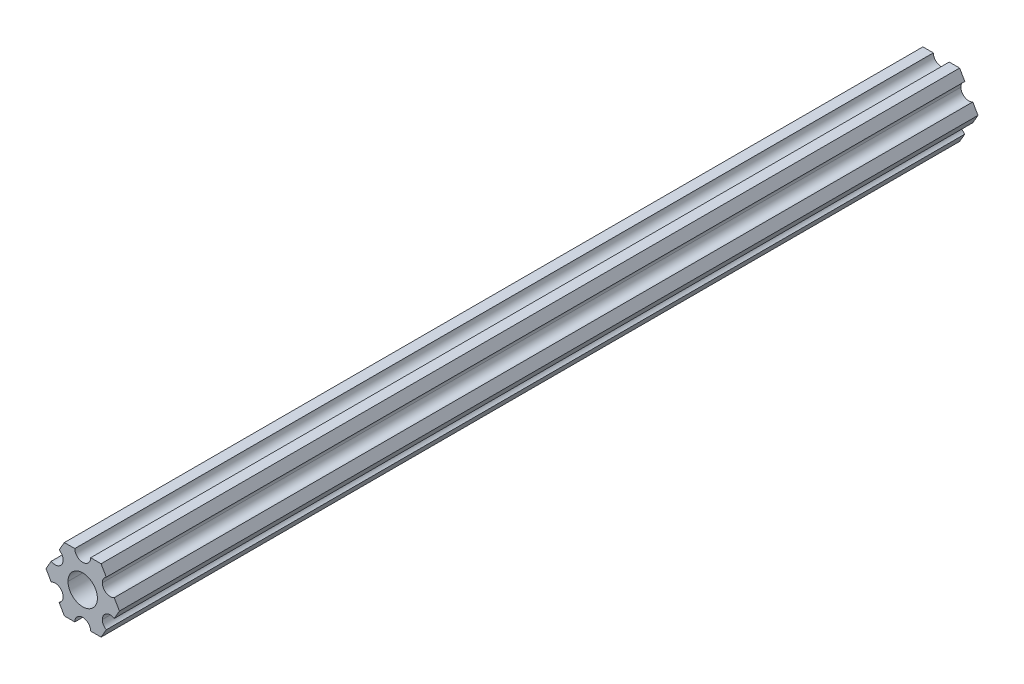
ISO-10303-21;
HEADER;
FILE_DESCRIPTION(('STEP AP214'),'2;1');
FILE_NAME('part.step','',(''),(''),'','','');
FILE_SCHEMA(('AUTOMOTIVE_DESIGN { 1 0 10303 214 1 1 1 1 }'));
ENDSEC;
DATA;
#1=APPLICATION_CONTEXT('core data for automotive mechanical design processes');
#2=APPLICATION_PROTOCOL_DEFINITION('international standard','automotive_design',2000,#1);
#3=PRODUCT_CONTEXT('',#1,'mechanical');
#4=PRODUCT('Part','Part','',(#3));
#5=PRODUCT_RELATED_PRODUCT_CATEGORY('part','',(#4));
#6=PRODUCT_DEFINITION_FORMATION('','',#4);
#7=PRODUCT_DEFINITION_CONTEXT('part definition',#1,'design');
#8=PRODUCT_DEFINITION('design','',#6,#7);
#9=PRODUCT_DEFINITION_SHAPE('','',#8);
#10=(LENGTH_UNIT() NAMED_UNIT(*) SI_UNIT(.MILLI.,.METRE.));
#11=(NAMED_UNIT(*) PLANE_ANGLE_UNIT() SI_UNIT($,.RADIAN.));
#12=(NAMED_UNIT(*) SI_UNIT($,.STERADIAN.) SOLID_ANGLE_UNIT());
#13=UNCERTAINTY_MEASURE_WITH_UNIT(LENGTH_MEASURE(1.E-05),#10,'distance_accuracy_value','');
#14=(GEOMETRIC_REPRESENTATION_CONTEXT(3) GLOBAL_UNCERTAINTY_ASSIGNED_CONTEXT((#13)) GLOBAL_UNIT_ASSIGNED_CONTEXT((#10,
#11,#12)) REPRESENTATION_CONTEXT('',''));
#15=CARTESIAN_POINT('',(0.,0.,0.));
#16=DIRECTION('',(0.,0.,1.));
#17=DIRECTION('',(1.,0.,0.));
#18=AXIS2_PLACEMENT_3D('',#15,#16,#17);
#19=CARTESIAN_POINT('',(0.,0.,304.8));
#20=DIRECTION('',(0.,0.,-1.));
#21=DIRECTION('',(-1.,0.,0.));
#22=AXIS2_PLACEMENT_3D('',#19,#20,#21);
#23=CYLINDRICAL_SURFACE('',#22,2.9337);
#24=CARTESIAN_POINT('',(0.,0.,171.45));
#25=DIRECTION('',(0.,0.,1.));
#26=DIRECTION('',(1.,0.,0.));
#27=AXIS2_PLACEMENT_3D('',#24,#25,#26);
#28=CIRCLE('',#27,2.9337);
#29=CARTESIAN_POINT('',(2.9337,0.,171.45));
#30=VERTEX_POINT('',#29);
#31=CARTESIAN_POINT('',(-2.9337,0.,171.45));
#32=VERTEX_POINT('',#31);
#33=EDGE_CURVE('E66',#30,#32,#28,.F.);
#34=ORIENTED_EDGE('',*,*,#33,.F.);
#35=DIRECTION('',(0.,0.,-1.));
#36=VECTOR('',#35,1.);
#37=CARTESIAN_POINT('',(2.9337,0.,304.8));
#38=LINE('',#37,#36);
#39=CARTESIAN_POINT('',(2.9337,0.,0.));
#40=VERTEX_POINT('',#39);
#41=EDGE_CURVE('E53',#30,#40,#38,.T.);
#42=ORIENTED_EDGE('',*,*,#41,.T.);
#43=CARTESIAN_POINT('',(0.,0.,0.));
#44=DIRECTION('',(0.,0.,1.));
#45=DIRECTION('',(1.,0.,0.));
#46=AXIS2_PLACEMENT_3D('',#43,#44,#45);
#47=CIRCLE('',#46,2.9337);
#48=CARTESIAN_POINT('',(-2.9337,0.,0.));
#49=VERTEX_POINT('',#48);
#50=EDGE_CURVE('E249',#49,#40,#47,.T.);
#51=ORIENTED_EDGE('',*,*,#50,.F.);
#52=DIRECTION('',(0.,0.,-1.));
#53=VECTOR('',#52,1.);
#54=CARTESIAN_POINT('',(-2.9337,0.,304.8));
#55=LINE('',#54,#53);
#56=EDGE_CURVE('E219',#32,#49,#55,.T.);
#57=ORIENTED_EDGE('',*,*,#56,.F.);
#58=EDGE_LOOP('',(#34,#42,#51,#57));
#59=FACE_BOUND('',#58,.T.);
#60=ADVANCED_FACE('F46',(#59),#23,.F.);
#61=CARTESIAN_POINT('',(5.49926150638082,-3.17499966684067,304.8));
#62=DIRECTION('',(0.,0.,-1.));
#63=DIRECTION('',(-1.,0.,0.));
#64=AXIS2_PLACEMENT_3D('',#61,#62,#63);
#65=CYLINDRICAL_SURFACE('',#64,1.5875);
#66=CARTESIAN_POINT('',(5.49926150638082,-3.17499966684067,171.45));
#67=DIRECTION('',(0.,0.,1.));
#68=DIRECTION('',(1.,0.,0.));
#69=AXIS2_PLACEMENT_3D('',#66,#67,#68);
#70=CIRCLE('',#69,1.5875);
#71=CARTESIAN_POINT('',(3.91176150638082,-3.17499966684067,171.45));
#72=VERTEX_POINT('',#71);
#73=CARTESIAN_POINT('',(6.29301142309098,-1.80018429024546,171.45));
#74=VERTEX_POINT('',#73);
#75=EDGE_CURVE('E373',#72,#74,#70,.F.);
#76=ORIENTED_EDGE('',*,*,#75,.F.);
#77=DIRECTION('',(0.,0.,-1.));
#78=VECTOR('',#77,1.);
#79=CARTESIAN_POINT('',(3.91176150638082,-3.17499966684067,304.8));
#80=LINE('',#79,#78);
#81=CARTESIAN_POINT('',(3.91176150638082,-3.17499966684067,0.));
#82=VERTEX_POINT('',#81);
#83=EDGE_CURVE('E226',#72,#82,#80,.T.);
#84=ORIENTED_EDGE('',*,*,#83,.T.);
#85=CARTESIAN_POINT('',(5.49926150638082,-3.17499966684067,0.));
#86=DIRECTION('',(0.,0.,-1.));
#87=DIRECTION('',(1.,0.,0.));
#88=AXIS2_PLACEMENT_3D('',#85,#86,#87);
#89=CIRCLE('',#88,1.5875);
#90=CARTESIAN_POINT('',(6.29301142309098,-1.80018429024546,0.));
#91=VERTEX_POINT('',#90);
#92=EDGE_CURVE('E228',#82,#91,#89,.T.);
#93=ORIENTED_EDGE('',*,*,#92,.T.);
#94=DIRECTION('',(0.,0.,-1.));
#95=VECTOR('',#94,1.);
#96=CARTESIAN_POINT('',(6.29301142309098,-1.80018429024546,304.8));
#97=LINE('',#96,#95);
#98=EDGE_CURVE('E354',#74,#91,#97,.T.);
#99=ORIENTED_EDGE('',*,*,#98,.F.);
#100=EDGE_LOOP('',(#76,#84,#93,#99));
#101=FACE_BOUND('',#100,.T.);
#102=ADVANCED_FACE('F409',(#101),#65,.F.);
#103=CARTESIAN_POINT('',(5.49926112168156,3.17500033315934,304.8));
#104=DIRECTION('',(0.,0.,-1.));
#105=DIRECTION('',(-1.,0.,0.));
#106=AXIS2_PLACEMENT_3D('',#103,#104,#105);
#107=CYLINDRICAL_SURFACE('',#106,1.5875);
#108=CARTESIAN_POINT('',(5.49926112168156,3.17500033315934,171.45));
#109=DIRECTION('',(0.,0.,1.));
#110=DIRECTION('',(1.,0.,0.));
#111=AXIS2_PLACEMENT_3D('',#108,#109,#110);
#112=CIRCLE('',#111,1.5875);
#113=CARTESIAN_POINT('',(3.91176112168156,3.17500033315934,171.45));
#114=VERTEX_POINT('',#113);
#115=CARTESIAN_POINT('',(4.70551103839172,4.54981561357972,171.45));
#116=VERTEX_POINT('',#115);
#117=EDGE_CURVE('E375',#114,#116,#112,.F.);
#118=ORIENTED_EDGE('',*,*,#117,.F.);
#119=DIRECTION('',(0.,0.,-1.));
#120=VECTOR('',#119,1.);
#121=CARTESIAN_POINT('',(3.91176112168156,3.17500033315934,304.8));
#122=LINE('',#121,#120);
#123=CARTESIAN_POINT('',(3.91176112168156,3.17500033315934,0.));
#124=VERTEX_POINT('',#123);
#125=EDGE_CURVE('E248',#114,#124,#122,.T.);
#126=ORIENTED_EDGE('',*,*,#125,.T.);
#127=CARTESIAN_POINT('',(5.49926112168156,3.17500033315934,0.));
#128=DIRECTION('',(0.,0.,-1.));
#129=DIRECTION('',(1.,0.,0.));
#130=AXIS2_PLACEMENT_3D('',#127,#128,#129);
#131=CIRCLE('',#130,1.5875);
#132=CARTESIAN_POINT('',(4.70551103839172,4.54981561357972,0.));
#133=VERTEX_POINT('',#132);
#134=EDGE_CURVE('E244',#124,#133,#131,.T.);
#135=ORIENTED_EDGE('',*,*,#134,.T.);
#136=DIRECTION('',(0.,0.,-1.));
#137=VECTOR('',#136,1.);
#138=CARTESIAN_POINT('',(4.70551103839172,4.54981561357972,304.8));
#139=LINE('',#138,#137);
#140=EDGE_CURVE('E287',#116,#133,#139,.T.);
#141=ORIENTED_EDGE('',*,*,#140,.F.);
#142=EDGE_LOOP('',(#118,#126,#135,#141));
#143=FACE_BOUND('',#142,.T.);
#144=ADVANCED_FACE('F483',(#143),#107,.F.);
#145=CARTESIAN_POINT('',(6.29301142309098,-1.80018429024546,304.8));
#146=DIRECTION('',(-0.866025434075723,0.499999947533953,0.));
#147=DIRECTION('',(0.,0.,1.));
#148=AXIS2_PLACEMENT_3D('',#145,#146,#147);
#149=PLANE('',#148);
#150=DIRECTION('',(0.499999947533953,0.866025434075723,0.));
#151=VECTOR('',#150,1.);
#152=CARTESIAN_POINT('',(6.29301142309098,-1.80018429024546,171.45));
#153=LINE('',#152,#151);
#154=CARTESIAN_POINT('',(7.33234841870827,4.44212519169686E-07,171.45));
#155=VERTEX_POINT('',#154);
#156=EDGE_CURVE('E293',#74,#155,#153,.T.);
#157=ORIENTED_EDGE('',*,*,#156,.F.);
#158=ORIENTED_EDGE('',*,*,#98,.T.);
#159=DIRECTION('',(0.499999947533953,0.866025434075723,0.));
#160=VECTOR('',#159,1.);
#161=CARTESIAN_POINT('',(6.29301142309098,-1.80018429024546,0.));
#162=LINE('',#161,#160);
#163=CARTESIAN_POINT('',(7.33234841870827,4.44212519169686E-07,0.));
#164=VERTEX_POINT('',#163);
#165=EDGE_CURVE('E252',#91,#164,#162,.T.);
#166=ORIENTED_EDGE('',*,*,#165,.T.);
#167=DIRECTION('',(0.,0.,-1.));
#168=VECTOR('',#167,1.);
#169=CARTESIAN_POINT('',(7.33234841870827,4.44212519169686E-07,304.8));
#170=LINE('',#169,#168);
#171=EDGE_CURVE('E259',#155,#164,#170,.T.);
#172=ORIENTED_EDGE('',*,*,#171,.F.);
#173=EDGE_LOOP('',(#157,#158,#166,#172));
#174=FACE_BOUND('',#173,.T.);
#175=ADVANCED_FACE('F492',(#174),#149,.F.);
#176=CARTESIAN_POINT('',(7.33234841870827,4.44212519169686E-07,304.8));
#177=DIRECTION('',(-0.866025373493145,-0.500000052466057,0.));
#178=DIRECTION('',(-0.500000052466057,0.866025373493145,0.));
#179=AXIS2_PLACEMENT_3D('',#176,#177,#178);
#180=PLANE('',#179);
#181=DIRECTION('',(-0.500000052466057,0.866025373493145,0.));
#182=VECTOR('',#181,1.);
#183=CARTESIAN_POINT('',(7.33234841870827,4.44212519169686E-07,171.45));
#184=LINE('',#183,#182);
#185=CARTESIAN_POINT('',(6.29301120497139,1.80018505273895,171.45));
#186=VERTEX_POINT('',#185);
#187=EDGE_CURVE('E369',#155,#186,#184,.T.);
#188=ORIENTED_EDGE('',*,*,#187,.F.);
#189=ORIENTED_EDGE('',*,*,#171,.T.);
#190=DIRECTION('',(-0.500000052466056,0.866025373493145,0.));
#191=VECTOR('',#190,1.);
#192=CARTESIAN_POINT('',(7.33234841870827,4.44212519169686E-07,0.));
#193=LINE('',#192,#191);
#194=CARTESIAN_POINT('',(6.29301120497139,1.80018505273894,0.));
#195=VERTEX_POINT('',#194);
#196=EDGE_CURVE('E342',#164,#195,#193,.T.);
#197=ORIENTED_EDGE('',*,*,#196,.T.);
#198=DIRECTION('',(0.,0.,-1.));
#199=VECTOR('',#198,1.);
#200=CARTESIAN_POINT('',(6.29301120497139,1.80018505273894,304.8));
#201=LINE('',#200,#199);
#202=EDGE_CURVE('E257',#186,#195,#201,.T.);
#203=ORIENTED_EDGE('',*,*,#202,.F.);
#204=EDGE_LOOP('',(#188,#189,#197,#203));
#205=FACE_BOUND('',#204,.T.);
#206=ADVANCED_FACE('F490',(#205),#180,.F.);
#207=CARTESIAN_POINT('',(5.49926112168156,3.17500033315934,304.8));
#208=DIRECTION('',(0.,0.,-1.));
#209=DIRECTION('',(-1.,0.,0.));
#210=AXIS2_PLACEMENT_3D('',#207,#208,#209);
#211=CYLINDRICAL_SURFACE('',#210,1.5875);
#212=CARTESIAN_POINT('',(5.49926112168156,3.17500033315934,171.45));
#213=DIRECTION('',(0.,0.,1.));
#214=DIRECTION('',(1.,0.,0.));
#215=AXIS2_PLACEMENT_3D('',#212,#213,#214);
#216=CIRCLE('',#215,1.5875);
#217=EDGE_CURVE('E371',#186,#114,#216,.F.);
#218=ORIENTED_EDGE('',*,*,#217,.F.);
#219=ORIENTED_EDGE('',*,*,#202,.T.);
#220=CARTESIAN_POINT('',(5.49926112168156,3.17500033315934,0.));
#221=DIRECTION('',(0.,0.,-1.));
#222=DIRECTION('',(1.,0.,0.));
#223=AXIS2_PLACEMENT_3D('',#220,#221,#222);
#224=CIRCLE('',#223,1.5875);
#225=EDGE_CURVE('E260',#195,#124,#224,.T.);
#226=ORIENTED_EDGE('',*,*,#225,.T.);
#227=ORIENTED_EDGE('',*,*,#125,.F.);
#228=EDGE_LOOP('',(#218,#219,#226,#227));
#229=FACE_BOUND('',#228,.T.);
#230=ADVANCED_FACE('F488',(#229),#211,.F.);
#231=CARTESIAN_POINT('',(4.70551103839172,4.54981561357972,304.8));
#232=DIRECTION('',(-0.866025373493151,-0.500000052466046,0.));
#233=DIRECTION('',(-0.500000052466046,0.866025373493151,0.));
#234=AXIS2_PLACEMENT_3D('',#231,#232,#233);
#235=PLANE('',#234);
#236=DIRECTION('',(-0.500000052466046,0.866025373493151,0.));
#237=VECTOR('',#236,1.);
#238=CARTESIAN_POINT('',(4.70551103839172,4.54981561357972,171.45));
#239=LINE('',#238,#237);
#240=CARTESIAN_POINT('',(3.66617382465481,6.35000022210627,171.45));
#241=VERTEX_POINT('',#240);
#242=EDGE_CURVE('E377',#116,#241,#239,.T.);
#243=ORIENTED_EDGE('',*,*,#242,.F.);
#244=ORIENTED_EDGE('',*,*,#140,.T.);
#245=DIRECTION('',(-0.500000052466046,0.866025373493151,0.));
#246=VECTOR('',#245,1.);
#247=CARTESIAN_POINT('',(4.70551103839172,4.54981561357972,0.));
#248=LINE('',#247,#246);
#249=CARTESIAN_POINT('',(3.66617382465481,6.35000022210627,0.));
#250=VERTEX_POINT('',#249);
#251=EDGE_CURVE('E306',#133,#250,#248,.T.);
#252=ORIENTED_EDGE('',*,*,#251,.T.);
#253=DIRECTION('',(0.,0.,-1.));
#254=VECTOR('',#253,1.);
#255=CARTESIAN_POINT('',(3.66617382465481,6.35000022210627,304.8));
#256=LINE('',#255,#254);
#257=EDGE_CURVE('E288',#241,#250,#256,.T.);
#258=ORIENTED_EDGE('',*,*,#257,.F.);
#259=EDGE_LOOP('',(#243,#244,#252,#258));
#260=FACE_BOUND('',#259,.T.);
#261=ADVANCED_FACE('F479',(#260),#235,.F.);
#262=CARTESIAN_POINT('',(3.66617382465481,6.35000022210627,304.8));
#263=DIRECTION('',(6.05825850611185E-08,-1.,0.));
#264=DIRECTION('',(0.,0.,-1.));
#265=AXIS2_PLACEMENT_3D('',#262,#263,#264);
#266=PLANE('',#265);
#267=DIRECTION('',(-0.999999999999998,-6.05825850611184E-08,0.));
#268=VECTOR('',#267,1.);
#269=CARTESIAN_POINT('',(3.66617382465481,6.35000022210627,171.45));
#270=LINE('',#269,#268);
#271=CARTESIAN_POINT('',(1.58749961530074,6.35,171.45));
#272=VERTEX_POINT('',#271);
#273=EDGE_CURVE('E379',#241,#272,#270,.T.);
#274=ORIENTED_EDGE('',*,*,#273,.F.);
#275=ORIENTED_EDGE('',*,*,#257,.T.);
#276=DIRECTION('',(-1.,-6.05825850611185E-08,0.));
#277=VECTOR('',#276,1.);
#278=CARTESIAN_POINT('',(3.66617382465481,6.35000022210627,0.));
#279=LINE('',#278,#277);
#280=CARTESIAN_POINT('',(1.58749961530074,6.35000009617482,0.));
#281=VERTEX_POINT('',#280);
#282=EDGE_CURVE('E283',#250,#281,#279,.T.);
#283=ORIENTED_EDGE('',*,*,#282,.T.);
#284=DIRECTION('',(0.,0.,-1.));
#285=VECTOR('',#284,1.);
#286=CARTESIAN_POINT('',(1.58749961530074,6.35000009617482,304.8));
#287=LINE('',#286,#285);
#288=EDGE_CURVE('E261',#272,#281,#287,.T.);
#289=ORIENTED_EDGE('',*,*,#288,.F.);
#290=EDGE_LOOP('',(#274,#275,#283,#289));
#291=FACE_BOUND('',#290,.T.);
#292=ADVANCED_FACE('F473',(#291),#266,.F.);
#293=CARTESIAN_POINT('',(-3.84699260060323E-07,6.35,304.8));
#294=DIRECTION('',(0.,0.,-1.));
#295=DIRECTION('',(-1.,0.,0.));
#296=AXIS2_PLACEMENT_3D('',#293,#294,#295);
#297=CYLINDRICAL_SURFACE('',#296,1.5875);
#298=CARTESIAN_POINT('',(-3.84699260060323E-07,6.35,171.45));
#299=DIRECTION('',(0.,0.,1.));
#300=DIRECTION('',(1.,0.,0.));
#301=AXIS2_PLACEMENT_3D('',#298,#299,#300);
#302=CIRCLE('',#301,1.5875);
#303=CARTESIAN_POINT('',(-1.58750038469926,6.34999990382518,171.45));
#304=VERTEX_POINT('',#303);
#305=EDGE_CURVE('E381',#272,#304,#302,.F.);
#306=ORIENTED_EDGE('',*,*,#305,.F.);
#307=ORIENTED_EDGE('',*,*,#288,.T.);
#308=CARTESIAN_POINT('',(-3.84699260060323E-07,6.35,0.));
#309=DIRECTION('',(0.,0.,-1.));
#310=DIRECTION('',(1.,0.,0.));
#311=AXIS2_PLACEMENT_3D('',#308,#309,#310);
#312=CIRCLE('',#311,1.5875);
#313=CARTESIAN_POINT('',(-1.58750038469926,6.34999990382519,0.));
#314=VERTEX_POINT('',#313);
#315=EDGE_CURVE('E263',#281,#314,#312,.T.);
#316=ORIENTED_EDGE('',*,*,#315,.T.);
#317=DIRECTION('',(0.,0.,-1.));
#318=VECTOR('',#317,1.);
#319=CARTESIAN_POINT('',(-1.58750038469926,6.34999990382519,304.8));
#320=LINE('',#319,#318);
#321=EDGE_CURVE('E300',#304,#314,#320,.T.);
#322=ORIENTED_EDGE('',*,*,#321,.F.);
#323=EDGE_LOOP('',(#306,#307,#316,#322));
#324=FACE_BOUND('',#323,.T.);
#325=ADVANCED_FACE('F469',(#324),#297,.F.);
#326=CARTESIAN_POINT('',(-1.58750038469926,6.34999990382518,304.8));
#327=DIRECTION('',(6.05825963273174E-08,-1.,0.));
#328=DIRECTION('',(0.,0.,-1.));
#329=AXIS2_PLACEMENT_3D('',#326,#327,#328);
#330=PLANE('',#329);
#331=DIRECTION('',(-0.999999999999998,-6.05825963273173E-08,0.));
#332=VECTOR('',#331,1.);
#333=CARTESIAN_POINT('',(-1.58750038469926,6.34999990382518,171.45));
#334=LINE('',#333,#332);
#335=CARTESIAN_POINT('',(-3.66617459405349,6.3499997778937,171.45));
#336=VERTEX_POINT('',#335);
#337=EDGE_CURVE('E383',#304,#336,#334,.T.);
#338=ORIENTED_EDGE('',*,*,#337,.F.);
#339=ORIENTED_EDGE('',*,*,#321,.T.);
#340=DIRECTION('',(-1.,-6.05825963273174E-08,0.));
#341=VECTOR('',#340,1.);
#342=CARTESIAN_POINT('',(-1.58750038469926,6.34999990382518,0.));
#343=LINE('',#342,#341);
#344=CARTESIAN_POINT('',(-3.66617459405349,6.3499997778937,0.));
#345=VERTEX_POINT('',#344);
#346=EDGE_CURVE('E264',#314,#345,#343,.T.);
#347=ORIENTED_EDGE('',*,*,#346,.T.);
#348=DIRECTION('',(0.,0.,-1.));
#349=VECTOR('',#348,1.);
#350=CARTESIAN_POINT('',(-3.66617459405349,6.3499997778937,304.8));
#351=LINE('',#350,#349);
#352=EDGE_CURVE('E279',#336,#345,#351,.T.);
#353=ORIENTED_EDGE('',*,*,#352,.F.);
#354=EDGE_LOOP('',(#338,#339,#347,#353));
#355=FACE_BOUND('',#354,.T.);
#356=ADVANCED_FACE('F511',(#355),#330,.F.);
#357=CARTESIAN_POINT('',(-3.66617459405349,6.3499997778937,304.8));
#358=DIRECTION('',(0.866025434075729,-0.499999947533942,0.));
#359=DIRECTION('',(0.,0.,-1.));
#360=AXIS2_PLACEMENT_3D('',#357,#358,#359);
#361=PLANE('',#360);
#362=DIRECTION('',(-0.499999947533942,-0.866025434075729,0.));
#363=VECTOR('',#362,1.);
#364=CARTESIAN_POINT('',(-3.66617459405349,6.3499997778937,171.45));
#365=LINE('',#364,#363);
#366=CARTESIAN_POINT('',(-4.70551158967065,4.54981504343587,171.45));
#367=VERTEX_POINT('',#366);
#368=EDGE_CURVE('E385',#336,#367,#365,.T.);
#369=ORIENTED_EDGE('',*,*,#368,.F.);
#370=ORIENTED_EDGE('',*,*,#352,.T.);
#371=DIRECTION('',(-0.499999947533943,-0.866025434075729,0.));
#372=VECTOR('',#371,1.);
#373=CARTESIAN_POINT('',(-3.66617459405349,6.3499997778937,0.));
#374=LINE('',#373,#372);
#375=CARTESIAN_POINT('',(-4.70551158967065,4.54981504343587,0.));
#376=VERTEX_POINT('',#375);
#377=EDGE_CURVE('E281',#345,#376,#374,.T.);
#378=ORIENTED_EDGE('',*,*,#377,.T.);
#379=DIRECTION('',(0.,0.,-1.));
#380=VECTOR('',#379,1.);
#381=CARTESIAN_POINT('',(-4.70551158967065,4.54981504343587,304.8));
#382=LINE('',#381,#380);
#383=EDGE_CURVE('E256',#367,#376,#382,.T.);
#384=ORIENTED_EDGE('',*,*,#383,.F.);
#385=EDGE_LOOP('',(#369,#370,#378,#384));
#386=FACE_BOUND('',#385,.T.);
#387=ADVANCED_FACE('F464',(#386),#361,.F.);
#388=CARTESIAN_POINT('',(-5.49926150638082,3.17499966684067,304.8));
#389=DIRECTION('',(0.,0.,-1.));
#390=DIRECTION('',(-1.,0.,0.));
#391=AXIS2_PLACEMENT_3D('',#388,#389,#390);
#392=CYLINDRICAL_SURFACE('',#391,1.5875);
#393=CARTESIAN_POINT('',(-5.49926150638082,3.17499966684067,171.45));
#394=DIRECTION('',(0.,0.,1.));
#395=DIRECTION('',(1.,0.,0.));
#396=AXIS2_PLACEMENT_3D('',#393,#394,#395);
#397=CIRCLE('',#396,1.5875);
#398=CARTESIAN_POINT('',(-6.29301142309098,1.80018429024547,171.45));
#399=VERTEX_POINT('',#398);
#400=EDGE_CURVE('E387',#367,#399,#397,.F.);
#401=ORIENTED_EDGE('',*,*,#400,.F.);
#402=ORIENTED_EDGE('',*,*,#383,.T.);
#403=CARTESIAN_POINT('',(-5.49926150638082,3.17499966684067,0.));
#404=DIRECTION('',(0.,0.,-1.));
#405=DIRECTION('',(1.,0.,0.));
#406=AXIS2_PLACEMENT_3D('',#403,#404,#405);
#407=CIRCLE('',#406,1.5875);
#408=CARTESIAN_POINT('',(-6.29301142309098,1.80018429024547,0.));
#409=VERTEX_POINT('',#408);
#410=EDGE_CURVE('E282',#376,#409,#407,.T.);
#411=ORIENTED_EDGE('',*,*,#410,.T.);
#412=DIRECTION('',(0.,0.,-1.));
#413=VECTOR('',#412,1.);
#414=CARTESIAN_POINT('',(-6.29301142309098,1.80018429024547,304.8));
#415=LINE('',#414,#413);
#416=EDGE_CURVE('E232',#399,#409,#415,.T.);
#417=ORIENTED_EDGE('',*,*,#416,.F.);
#418=EDGE_LOOP('',(#401,#402,#411,#417));
#419=FACE_BOUND('',#418,.T.);
#420=ADVANCED_FACE('F460',(#419),#392,.F.);
#421=CARTESIAN_POINT('',(-6.29301142309098,1.80018429024547,304.8));
#422=DIRECTION('',(0.866025434075724,-0.499999947533952,0.));
#423=DIRECTION('',(0.,0.,-1.));
#424=AXIS2_PLACEMENT_3D('',#421,#422,#423);
#425=PLANE('',#424);
#426=DIRECTION('',(-0.499999947533952,-0.866025434075724,0.));
#427=VECTOR('',#426,1.);
#428=CARTESIAN_POINT('',(-6.29301142309098,1.80018429024547,171.45));
#429=LINE('',#428,#427);
#430=CARTESIAN_POINT('',(-7.33234841870827,-4.44212523790841E-07,171.45));
#431=VERTEX_POINT('',#430);
#432=EDGE_CURVE('E389',#399,#431,#429,.T.);
#433=ORIENTED_EDGE('',*,*,#432,.F.);
#434=ORIENTED_EDGE('',*,*,#416,.T.);
#435=DIRECTION('',(-0.499999947533951,-0.866025434075724,0.));
#436=VECTOR('',#435,1.);
#437=CARTESIAN_POINT('',(-6.29301142309098,1.80018429024547,0.));
#438=LINE('',#437,#436);
#439=CARTESIAN_POINT('',(-7.33234841870827,-4.44212523790841E-07,0.));
#440=VERTEX_POINT('',#439);
#441=EDGE_CURVE('E234',#409,#440,#438,.T.);
#442=ORIENTED_EDGE('',*,*,#441,.T.);
#443=DIRECTION('',(0.,0.,-1.));
#444=VECTOR('',#443,1.);
#445=CARTESIAN_POINT('',(-7.33234841870827,-4.44212523790841E-07,304.8));
#446=LINE('',#445,#444);
#447=EDGE_CURVE('E265',#431,#440,#446,.T.);
#448=ORIENTED_EDGE('',*,*,#447,.F.);
#449=EDGE_LOOP('',(#433,#434,#442,#448));
#450=FACE_BOUND('',#449,.T.);
#451=ADVANCED_FACE('F454',(#450),#425,.F.);
#452=CARTESIAN_POINT('',(-7.33234841870827,-4.44212523790841E-07,304.8));
#453=DIRECTION('',(0.866025373493151,0.500000052466045,0.));
#454=DIRECTION('',(0.,0.,-1.));
#455=AXIS2_PLACEMENT_3D('',#452,#453,#454);
#456=PLANE('',#455);
#457=DIRECTION('',(0.500000052466045,-0.866025373493151,0.));
#458=VECTOR('',#457,1.);
#459=CARTESIAN_POINT('',(-7.33234841870827,-4.44212523790841E-07,171.45));
#460=LINE('',#459,#458);
#461=CARTESIAN_POINT('',(-6.29301120497141,-1.80018505273896,171.45));
#462=VERTEX_POINT('',#461);
#463=EDGE_CURVE('E391',#431,#462,#460,.T.);
#464=ORIENTED_EDGE('',*,*,#463,.F.);
#465=ORIENTED_EDGE('',*,*,#447,.T.);
#466=DIRECTION('',(0.500000052466045,-0.866025373493151,0.));
#467=VECTOR('',#466,1.);
#468=CARTESIAN_POINT('',(-7.33234841870827,-4.44212523790841E-07,0.));
#469=LINE('',#468,#467);
#470=CARTESIAN_POINT('',(-6.29301120497141,-1.80018505273897,0.));
#471=VERTEX_POINT('',#470);
#472=EDGE_CURVE('E235',#440,#471,#469,.T.);
#473=ORIENTED_EDGE('',*,*,#472,.T.);
#474=DIRECTION('',(0.,0.,-1.));
#475=VECTOR('',#474,1.);
#476=CARTESIAN_POINT('',(-6.29301120497141,-1.80018505273897,304.8));
#477=LINE('',#476,#475);
#478=EDGE_CURVE('E243',#462,#471,#477,.T.);
#479=ORIENTED_EDGE('',*,*,#478,.F.);
#480=EDGE_LOOP('',(#464,#465,#473,#479));
#481=FACE_BOUND('',#480,.T.);
#482=ADVANCED_FACE('F450',(#481),#456,.F.);
#483=CARTESIAN_POINT('',(-5.49926112168156,-3.17500033315934,304.8));
#484=DIRECTION('',(0.,0.,-1.));
#485=DIRECTION('',(-1.,0.,0.));
#486=AXIS2_PLACEMENT_3D('',#483,#484,#485);
#487=CYLINDRICAL_SURFACE('',#486,1.5875);
#488=CARTESIAN_POINT('',(-5.49926112168156,-3.17500033315934,171.45));
#489=DIRECTION('',(0.,0.,1.));
#490=DIRECTION('',(1.,0.,0.));
#491=AXIS2_PLACEMENT_3D('',#488,#489,#490);
#492=CIRCLE('',#491,1.5875);
#493=CARTESIAN_POINT('',(-4.70551103839172,-4.54981561357972,171.45));
#494=VERTEX_POINT('',#493);
#495=EDGE_CURVE('E393',#462,#494,#492,.F.);
#496=ORIENTED_EDGE('',*,*,#495,.F.);
#497=ORIENTED_EDGE('',*,*,#478,.T.);
#498=CARTESIAN_POINT('',(-5.49926112168156,-3.17500033315934,0.));
#499=DIRECTION('',(0.,0.,-1.));
#500=DIRECTION('',(1.,0.,0.));
#501=AXIS2_PLACEMENT_3D('',#498,#499,#500);
#502=CIRCLE('',#501,1.5875);
#503=CARTESIAN_POINT('',(-4.70551103839172,-4.54981561357972,0.));
#504=VERTEX_POINT('',#503);
#505=EDGE_CURVE('E267',#471,#504,#502,.T.);
#506=ORIENTED_EDGE('',*,*,#505,.T.);
#507=DIRECTION('',(0.,0.,-1.));
#508=VECTOR('',#507,1.);
#509=CARTESIAN_POINT('',(-4.70551103839172,-4.54981561357972,304.8));
#510=LINE('',#509,#508);
#511=EDGE_CURVE('E236',#494,#504,#510,.T.);
#512=ORIENTED_EDGE('',*,*,#511,.F.);
#513=EDGE_LOOP('',(#496,#497,#506,#512));
#514=FACE_BOUND('',#513,.T.);
#515=ADVANCED_FACE('F444',(#514),#487,.F.);
#516=CARTESIAN_POINT('',(-4.70551103839172,-4.54981561357972,304.8));
#517=DIRECTION('',(0.866025373493152,0.500000052466045,0.));
#518=DIRECTION('',(0.,0.,-1.));
#519=AXIS2_PLACEMENT_3D('',#516,#517,#518);
#520=PLANE('',#519);
#521=DIRECTION('',(0.500000052466045,-0.866025373493152,0.));
#522=VECTOR('',#521,1.);
#523=CARTESIAN_POINT('',(-4.70551103839172,-4.54981561357972,171.45));
#524=LINE('',#523,#522);
#525=CARTESIAN_POINT('',(-3.66617382465481,-6.35000022210628,171.45));
#526=VERTEX_POINT('',#525);
#527=EDGE_CURVE('E395',#494,#526,#524,.T.);
#528=ORIENTED_EDGE('',*,*,#527,.F.);
#529=ORIENTED_EDGE('',*,*,#511,.T.);
#530=DIRECTION('',(0.500000052466045,-0.866025373493152,0.));
#531=VECTOR('',#530,1.);
#532=CARTESIAN_POINT('',(-4.70551103839172,-4.54981561357972,0.));
#533=LINE('',#532,#531);
#534=CARTESIAN_POINT('',(-3.66617382465481,-6.35000022210628,0.));
#535=VERTEX_POINT('',#534);
#536=EDGE_CURVE('E238',#504,#535,#533,.T.);
#537=ORIENTED_EDGE('',*,*,#536,.T.);
#538=DIRECTION('',(0.,0.,-1.));
#539=VECTOR('',#538,1.);
#540=CARTESIAN_POINT('',(-3.66617382465481,-6.35000022210628,304.8));
#541=LINE('',#540,#539);
#542=EDGE_CURVE('E340',#526,#535,#541,.T.);
#543=ORIENTED_EDGE('',*,*,#542,.F.);
#544=EDGE_LOOP('',(#528,#529,#537,#543));
#545=FACE_BOUND('',#544,.T.);
#546=ADVANCED_FACE('F440',(#545),#520,.F.);
#547=CARTESIAN_POINT('',(-3.66617382465481,-6.35000022210628,304.8));
#548=DIRECTION('',(-6.05825854783851E-08,1.,0.));
#549=DIRECTION('',(0.,0.,1.));
#550=AXIS2_PLACEMENT_3D('',#547,#548,#549);
#551=PLANE('',#550);
#552=DIRECTION('',(0.999999999999998,6.0582585478385E-08,0.));
#553=VECTOR('',#552,1.);
#554=CARTESIAN_POINT('',(-3.66617382465481,-6.35000022210628,171.45));
#555=LINE('',#554,#553);
#556=CARTESIAN_POINT('',(-1.58749961530073,-6.35000009617482,171.45));
#557=VERTEX_POINT('',#556);
#558=EDGE_CURVE('E397',#526,#557,#555,.T.);
#559=ORIENTED_EDGE('',*,*,#558,.F.);
#560=ORIENTED_EDGE('',*,*,#542,.T.);
#561=DIRECTION('',(1.,6.05825854783851E-08,0.));
#562=VECTOR('',#561,1.);
#563=CARTESIAN_POINT('',(-3.66617382465481,-6.35000022210628,0.));
#564=LINE('',#563,#562);
#565=CARTESIAN_POINT('',(-1.58749961530073,-6.35000009617482,0.));
#566=VERTEX_POINT('',#565);
#567=EDGE_CURVE('E239',#535,#566,#564,.T.);
#568=ORIENTED_EDGE('',*,*,#567,.T.);
#569=DIRECTION('',(0.,0.,-1.));
#570=VECTOR('',#569,1.);
#571=CARTESIAN_POINT('',(-1.58749961530073,-6.35000009617482,304.8));
#572=LINE('',#571,#570);
#573=EDGE_CURVE('E305',#557,#566,#572,.T.);
#574=ORIENTED_EDGE('',*,*,#573,.F.);
#575=EDGE_LOOP('',(#559,#560,#568,#574));
#576=FACE_BOUND('',#575,.T.);
#577=ADVANCED_FACE('F434',(#576),#551,.F.);
#578=CARTESIAN_POINT('',(3.8469926204343E-07,-6.35,304.8));
#579=DIRECTION('',(0.,0.,-1.));
#580=DIRECTION('',(-1.,0.,0.));
#581=AXIS2_PLACEMENT_3D('',#578,#579,#580);
#582=CYLINDRICAL_SURFACE('',#581,1.5875);
#583=CARTESIAN_POINT('',(3.8469926204343E-07,-6.35,171.45));
#584=DIRECTION('',(0.,0.,1.));
#585=DIRECTION('',(1.,0.,0.));
#586=AXIS2_PLACEMENT_3D('',#583,#584,#585);
#587=CIRCLE('',#586,1.5875);
#588=CARTESIAN_POINT('',(1.58750038469926,-6.34999990382518,171.45));
#589=VERTEX_POINT('',#588);
#590=EDGE_CURVE('E399',#557,#589,#587,.F.);
#591=ORIENTED_EDGE('',*,*,#590,.F.);
#592=ORIENTED_EDGE('',*,*,#573,.T.);
#593=CARTESIAN_POINT('',(3.8469926204343E-07,-6.35,0.));
#594=DIRECTION('',(0.,0.,-1.));
#595=DIRECTION('',(1.,0.,0.));
#596=AXIS2_PLACEMENT_3D('',#593,#594,#595);
#597=CIRCLE('',#596,1.5875);
#598=CARTESIAN_POINT('',(1.58750038469926,-6.34999990382518,0.));
#599=VERTEX_POINT('',#598);
#600=EDGE_CURVE('E336',#566,#599,#597,.T.);
#601=ORIENTED_EDGE('',*,*,#600,.T.);
#602=DIRECTION('',(0.,0.,-1.));
#603=VECTOR('',#602,1.);
#604=CARTESIAN_POINT('',(1.58750038469926,-6.34999990382518,304.8));
#605=LINE('',#604,#603);
#606=EDGE_CURVE('E273',#589,#599,#605,.T.);
#607=ORIENTED_EDGE('',*,*,#606,.F.);
#608=EDGE_LOOP('',(#591,#592,#601,#607));
#609=FACE_BOUND('',#608,.T.);
#610=ADVANCED_FACE('F430',(#609),#582,.F.);
#611=CARTESIAN_POINT('',(1.58750038469926,-6.34999990382518,304.8));
#612=DIRECTION('',(-6.05825721258438E-08,1.,0.));
#613=DIRECTION('',(0.,0.,1.));
#614=AXIS2_PLACEMENT_3D('',#611,#612,#613);
#615=PLANE('',#614);
#616=DIRECTION('',(0.999999999999998,6.05825721258437E-08,0.));
#617=VECTOR('',#616,1.);
#618=CARTESIAN_POINT('',(1.58750038469926,-6.34999990382518,171.45));
#619=LINE('',#618,#617);
#620=CARTESIAN_POINT('',(3.66617459405346,-6.34999977789375,171.45));
#621=VERTEX_POINT('',#620);
#622=EDGE_CURVE('E401',#589,#621,#619,.T.);
#623=ORIENTED_EDGE('',*,*,#622,.F.);
#624=ORIENTED_EDGE('',*,*,#606,.T.);
#625=DIRECTION('',(1.,6.05825721258438E-08,0.));
#626=VECTOR('',#625,1.);
#627=CARTESIAN_POINT('',(1.58750038469926,-6.34999990382518,0.));
#628=LINE('',#627,#626);
#629=CARTESIAN_POINT('',(3.66617459405346,-6.34999977789375,0.));
#630=VERTEX_POINT('',#629);
#631=EDGE_CURVE('E301',#599,#630,#628,.T.);
#632=ORIENTED_EDGE('',*,*,#631,.T.);
#633=DIRECTION('',(0.,0.,-1.));
#634=VECTOR('',#633,1.);
#635=CARTESIAN_POINT('',(3.66617459405346,-6.34999977789375,304.8));
#636=LINE('',#635,#634);
#637=EDGE_CURVE('E274',#621,#630,#636,.T.);
#638=ORIENTED_EDGE('',*,*,#637,.F.);
#639=EDGE_LOOP('',(#623,#624,#632,#638));
#640=FACE_BOUND('',#639,.T.);
#641=ADVANCED_FACE('F424',(#640),#615,.F.);
#642=CARTESIAN_POINT('',(3.66617459405346,-6.34999977789375,304.8));
#643=DIRECTION('',(-0.86602543407573,0.499999947533941,0.));
#644=DIRECTION('',(0.,0.,1.));
#645=AXIS2_PLACEMENT_3D('',#642,#643,#644);
#646=PLANE('',#645);
#647=DIRECTION('',(0.499999947533941,0.86602543407573,0.));
#648=VECTOR('',#647,1.);
#649=CARTESIAN_POINT('',(3.66617459405346,-6.34999977789375,171.45));
#650=LINE('',#649,#648);
#651=CARTESIAN_POINT('',(4.70551158967065,-4.54981504343587,171.45));
#652=VERTEX_POINT('',#651);
#653=EDGE_CURVE('E60',#621,#652,#650,.T.);
#654=ORIENTED_EDGE('',*,*,#653,.F.);
#655=ORIENTED_EDGE('',*,*,#637,.T.);
#656=DIRECTION('',(0.499999947533941,0.86602543407573,0.));
#657=VECTOR('',#656,1.);
#658=CARTESIAN_POINT('',(3.66617459405346,-6.34999977789375,0.));
#659=LINE('',#658,#657);
#660=CARTESIAN_POINT('',(4.70551158967065,-4.54981504343587,0.));
#661=VERTEX_POINT('',#660);
#662=EDGE_CURVE('E269',#630,#661,#659,.T.);
#663=ORIENTED_EDGE('',*,*,#662,.T.);
#664=DIRECTION('',(0.,0.,-1.));
#665=VECTOR('',#664,1.);
#666=CARTESIAN_POINT('',(4.70551158967065,-4.54981504343587,304.8));
#667=LINE('',#666,#665);
#668=EDGE_CURVE('E275',#652,#661,#667,.T.);
#669=ORIENTED_EDGE('',*,*,#668,.F.);
#670=EDGE_LOOP('',(#654,#655,#663,#669));
#671=FACE_BOUND('',#670,.T.);
#672=ADVANCED_FACE('F420',(#671),#646,.F.);
#673=CARTESIAN_POINT('',(5.49926150638082,-3.17499966684067,304.8));
#674=DIRECTION('',(0.,0.,-1.));
#675=DIRECTION('',(-1.,0.,0.));
#676=AXIS2_PLACEMENT_3D('',#673,#674,#675);
#677=CYLINDRICAL_SURFACE('',#676,1.5875);
#678=CARTESIAN_POINT('',(5.49926150638082,-3.17499966684067,171.45));
#679=DIRECTION('',(0.,0.,1.));
#680=DIRECTION('',(1.,0.,0.));
#681=AXIS2_PLACEMENT_3D('',#678,#679,#680);
#682=CIRCLE('',#681,1.5875);
#683=EDGE_CURVE('E220',#652,#72,#682,.F.);
#684=ORIENTED_EDGE('',*,*,#683,.F.);
#685=ORIENTED_EDGE('',*,*,#668,.T.);
#686=CARTESIAN_POINT('',(5.49926150638082,-3.17499966684067,0.));
#687=DIRECTION('',(0.,0.,-1.));
#688=DIRECTION('',(1.,0.,0.));
#689=AXIS2_PLACEMENT_3D('',#686,#687,#688);
#690=CIRCLE('',#689,1.5875);
#691=EDGE_CURVE('E277',#661,#82,#690,.T.);
#692=ORIENTED_EDGE('',*,*,#691,.T.);
#693=ORIENTED_EDGE('',*,*,#83,.F.);
#694=EDGE_LOOP('',(#684,#685,#692,#693));
#695=FACE_BOUND('',#694,.T.);
#696=ADVANCED_FACE('F411',(#695),#677,.F.);
#697=CARTESIAN_POINT('',(0.,0.,304.8));
#698=DIRECTION('',(0.,0.,-1.));
#699=DIRECTION('',(-1.,0.,0.));
#700=AXIS2_PLACEMENT_3D('',#697,#698,#699);
#701=CYLINDRICAL_SURFACE('',#700,2.9337);
#702=CARTESIAN_POINT('',(0.,0.,171.45));
#703=DIRECTION('',(0.,0.,1.));
#704=DIRECTION('',(1.,0.,0.));
#705=AXIS2_PLACEMENT_3D('',#702,#703,#704);
#706=CIRCLE('',#705,2.9337);
#707=EDGE_CURVE('E12',#32,#30,#706,.F.);
#708=ORIENTED_EDGE('',*,*,#707,.F.);
#709=ORIENTED_EDGE('',*,*,#56,.T.);
#710=CARTESIAN_POINT('',(0.,0.,0.));
#711=DIRECTION('',(0.,0.,1.));
#712=DIRECTION('',(1.,0.,0.));
#713=AXIS2_PLACEMENT_3D('',#710,#711,#712);
#714=CIRCLE('',#713,2.9337);
#715=EDGE_CURVE('E225',#40,#49,#714,.T.);
#716=ORIENTED_EDGE('',*,*,#715,.F.);
#717=ORIENTED_EDGE('',*,*,#41,.F.);
#718=EDGE_LOOP('',(#708,#709,#716,#717));
#719=FACE_BOUND('',#718,.T.);
#720=ADVANCED_FACE('F223',(#719),#701,.F.);
#721=CARTESIAN_POINT('',(5.49926112168156,3.17500033315934,0.));
#722=DIRECTION('',(0.,0.,1.));
#723=DIRECTION('',(1.,0.,0.));
#724=AXIS2_PLACEMENT_3D('',#721,#722,#723);
#725=PLANE('',#724);
#726=ORIENTED_EDGE('',*,*,#165,.F.);
#727=ORIENTED_EDGE('',*,*,#92,.F.);
#728=ORIENTED_EDGE('',*,*,#691,.F.);
#729=ORIENTED_EDGE('',*,*,#662,.F.);
#730=ORIENTED_EDGE('',*,*,#631,.F.);
#731=ORIENTED_EDGE('',*,*,#600,.F.);
#732=ORIENTED_EDGE('',*,*,#567,.F.);
#733=ORIENTED_EDGE('',*,*,#536,.F.);
#734=ORIENTED_EDGE('',*,*,#505,.F.);
#735=ORIENTED_EDGE('',*,*,#472,.F.);
#736=ORIENTED_EDGE('',*,*,#441,.F.);
#737=ORIENTED_EDGE('',*,*,#410,.F.);
#738=ORIENTED_EDGE('',*,*,#377,.F.);
#739=ORIENTED_EDGE('',*,*,#346,.F.);
#740=ORIENTED_EDGE('',*,*,#315,.F.);
#741=ORIENTED_EDGE('',*,*,#282,.F.);
#742=ORIENTED_EDGE('',*,*,#251,.F.);
#743=ORIENTED_EDGE('',*,*,#134,.F.);
#744=ORIENTED_EDGE('',*,*,#225,.F.);
#745=ORIENTED_EDGE('',*,*,#196,.F.);
#746=EDGE_LOOP('',(#726,#727,#728,#729,#730,#731,#732,#733,#734,#735,#736,#737,#738,#739,#740,
#741,#742,#743,#744,#745));
#747=FACE_BOUND('',#746,.T.);
#748=ORIENTED_EDGE('',*,*,#50,.T.);
#749=ORIENTED_EDGE('',*,*,#715,.T.);
#750=EDGE_LOOP('',(#748,#749));
#751=FACE_BOUND('',#750,.T.);
#752=ADVANCED_FACE('F416',(#747,#751),#725,.F.);
#753=CARTESIAN_POINT('',(5.49926112168156,3.17500033315934,171.45));
#754=DIRECTION('',(0.,0.,1.));
#755=DIRECTION('',(1.,0.,0.));
#756=AXIS2_PLACEMENT_3D('',#753,#754,#755);
#757=PLANE('',#756);
#758=ORIENTED_EDGE('',*,*,#33,.T.);
#759=ORIENTED_EDGE('',*,*,#707,.T.);
#760=EDGE_LOOP('',(#758,#759));
#761=FACE_BOUND('',#760,.T.);
#762=ORIENTED_EDGE('',*,*,#156,.T.);
#763=ORIENTED_EDGE('',*,*,#187,.T.);
#764=ORIENTED_EDGE('',*,*,#217,.T.);
#765=ORIENTED_EDGE('',*,*,#117,.T.);
#766=ORIENTED_EDGE('',*,*,#242,.T.);
#767=ORIENTED_EDGE('',*,*,#273,.T.);
#768=ORIENTED_EDGE('',*,*,#305,.T.);
#769=ORIENTED_EDGE('',*,*,#337,.T.);
#770=ORIENTED_EDGE('',*,*,#368,.T.);
#771=ORIENTED_EDGE('',*,*,#400,.T.);
#772=ORIENTED_EDGE('',*,*,#432,.T.);
#773=ORIENTED_EDGE('',*,*,#463,.T.);
#774=ORIENTED_EDGE('',*,*,#495,.T.);
#775=ORIENTED_EDGE('',*,*,#527,.T.);
#776=ORIENTED_EDGE('',*,*,#558,.T.);
#777=ORIENTED_EDGE('',*,*,#590,.T.);
#778=ORIENTED_EDGE('',*,*,#622,.T.);
#779=ORIENTED_EDGE('',*,*,#653,.T.);
#780=ORIENTED_EDGE('',*,*,#683,.T.);
#781=ORIENTED_EDGE('',*,*,#75,.T.);
#782=EDGE_LOOP('',(#762,#763,#764,#765,#766,#767,#768,#769,#770,#771,#772,#773,#774,#775,#776,
#777,#778,#779,#780,#781));
#783=FACE_BOUND('',#782,.T.);
#784=ADVANCED_FACE('F212',(#761,#783),#757,.T.);
#785=CLOSED_SHELL('',(#60,#102,#144,#175,#206,#230,#261,#292,#325,#356,#387,#420,#451,#482,#515,
#546,#577,#610,#641,#672,#696,#720,#752,#784));
#786=MANIFOLD_SOLID_BREP('B2',#785);
#787=ADVANCED_BREP_SHAPE_REPRESENTATION('',(#18,#786),#14);
#788=SHAPE_DEFINITION_REPRESENTATION(#9,#787);
ENDSEC;
END-ISO-10303-21;
